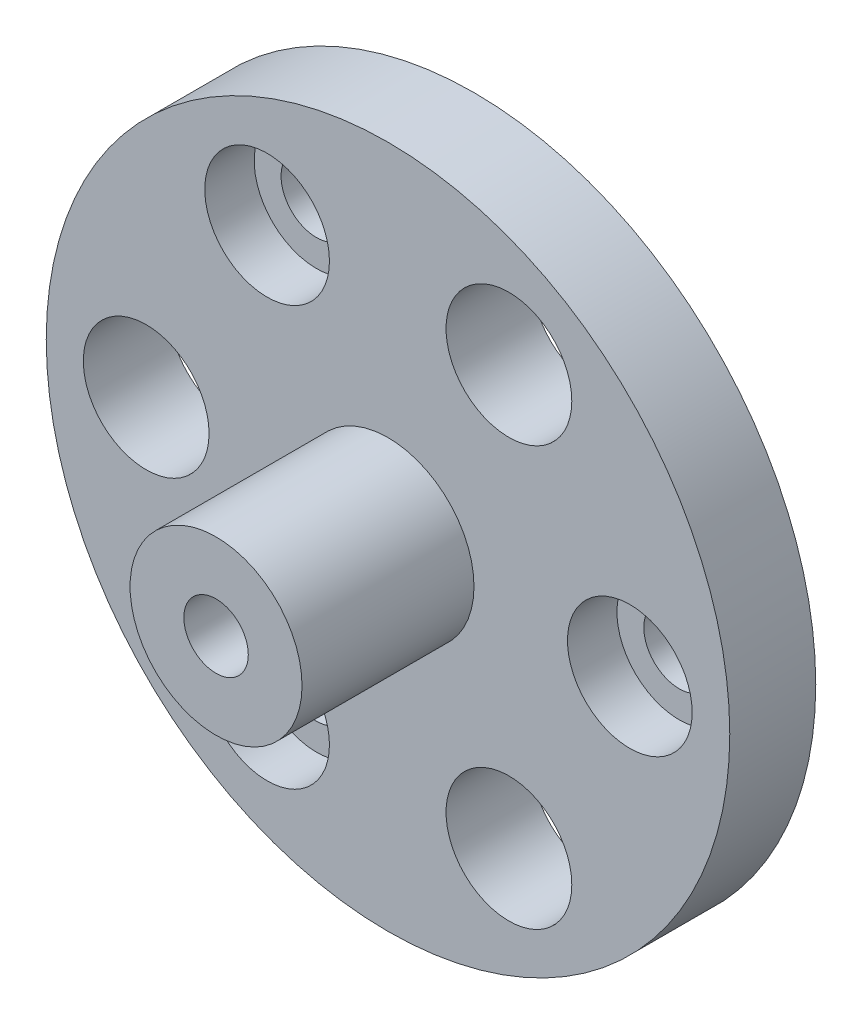
ISO-10303-21;
HEADER;
FILE_DESCRIPTION(('STEP AP214'),'2;1');
FILE_NAME('part.step','',(''),(''),'','','');
FILE_SCHEMA(('AUTOMOTIVE_DESIGN { 1 0 10303 214 1 1 1 1 }'));
ENDSEC;
DATA;
#1=APPLICATION_CONTEXT('core data for automotive mechanical design processes');
#2=APPLICATION_PROTOCOL_DEFINITION('international standard','automotive_design',2000,#1);
#3=PRODUCT_CONTEXT('',#1,'mechanical');
#4=PRODUCT('Part','Part','',(#3));
#5=PRODUCT_RELATED_PRODUCT_CATEGORY('part','',(#4));
#6=PRODUCT_DEFINITION_FORMATION('','',#4);
#7=PRODUCT_DEFINITION_CONTEXT('part definition',#1,'design');
#8=PRODUCT_DEFINITION('design','',#6,#7);
#9=PRODUCT_DEFINITION_SHAPE('','',#8);
#10=(LENGTH_UNIT() NAMED_UNIT(*) SI_UNIT(.MILLI.,.METRE.));
#11=(NAMED_UNIT(*) PLANE_ANGLE_UNIT() SI_UNIT($,.RADIAN.));
#12=(NAMED_UNIT(*) SI_UNIT($,.STERADIAN.) SOLID_ANGLE_UNIT());
#13=UNCERTAINTY_MEASURE_WITH_UNIT(LENGTH_MEASURE(1.E-05),#10,'distance_accuracy_value','');
#14=(GEOMETRIC_REPRESENTATION_CONTEXT(3) GLOBAL_UNCERTAINTY_ASSIGNED_CONTEXT((#13)) GLOBAL_UNIT_ASSIGNED_CONTEXT((#10,
#11,#12)) REPRESENTATION_CONTEXT('',''));
#15=CARTESIAN_POINT('',(0.,0.,0.));
#16=DIRECTION('',(0.,0.,1.));
#17=DIRECTION('',(1.,0.,0.));
#18=AXIS2_PLACEMENT_3D('',#15,#16,#17);
#19=CARTESIAN_POINT('',(14.2060725138052,15.206748874826,1002.15499802001));
#20=DIRECTION('',(0.,0.,-1.));
#21=DIRECTION('',(-1.,0.,0.));
#22=AXIS2_PLACEMENT_3D('',#19,#20,#21);
#23=CYLINDRICAL_SURFACE('',#22,1.65000000000001);
#24=CARTESIAN_POINT('',(14.2060725138052,15.206748874826,998.154998020007));
#25=DIRECTION('',(0.,0.,1.));
#26=DIRECTION('',(1.,0.,0.));
#27=AXIS2_PLACEMENT_3D('',#24,#25,#26);
#28=CIRCLE('',#27,1.65000000000001);
#29=CARTESIAN_POINT('',(15.8560725138052,15.206748874826,998.154998020007));
#30=VERTEX_POINT('',#29);
#31=EDGE_CURVE('E105',#30,#30,#28,.T.);
#32=ORIENTED_EDGE('',*,*,#31,.F.);
#33=EDGE_LOOP('',(#32));
#34=FACE_BOUND('',#33,.T.);
#35=CARTESIAN_POINT('',(14.2060725138052,15.206748874826,999.854998020007));
#36=DIRECTION('',(0.,0.,1.));
#37=DIRECTION('',(1.,0.,0.));
#38=AXIS2_PLACEMENT_3D('',#35,#36,#37);
#39=CIRCLE('',#38,1.65000000000001);
#40=CARTESIAN_POINT('',(15.8560725138052,15.206748874826,999.854998020007));
#41=VERTEX_POINT('',#40);
#42=EDGE_CURVE('E43',#41,#41,#39,.T.);
#43=ORIENTED_EDGE('',*,*,#42,.T.);
#44=EDGE_LOOP('',(#43));
#45=FACE_BOUND('',#44,.T.);
#46=ADVANCED_FACE('F39',(#34,#45),#23,.F.);
#47=CARTESIAN_POINT('',(-2.66892748619479,5.46396308225111,1002.15499802001));
#48=DIRECTION('',(0.,0.,-1.));
#49=DIRECTION('',(-1.,0.,0.));
#50=AXIS2_PLACEMENT_3D('',#47,#48,#49);
#51=CYLINDRICAL_SURFACE('',#50,1.65000000000001);
#52=CARTESIAN_POINT('',(-2.66892748619479,5.46396308225111,998.154998020007));
#53=DIRECTION('',(0.,0.,1.));
#54=DIRECTION('',(1.,0.,0.));
#55=AXIS2_PLACEMENT_3D('',#52,#53,#54);
#56=CIRCLE('',#55,1.65000000000001);
#57=CARTESIAN_POINT('',(-1.01892748619478,5.46396308225111,998.154998020007));
#58=VERTEX_POINT('',#57);
#59=EDGE_CURVE('E103',#58,#58,#56,.T.);
#60=ORIENTED_EDGE('',*,*,#59,.F.);
#61=EDGE_LOOP('',(#60));
#62=FACE_BOUND('',#61,.T.);
#63=CARTESIAN_POINT('',(-2.66892748619479,5.46396308225111,999.854998020007));
#64=DIRECTION('',(0.,0.,1.));
#65=DIRECTION('',(1.,0.,0.));
#66=AXIS2_PLACEMENT_3D('',#63,#64,#65);
#67=CIRCLE('',#66,1.65000000000001);
#68=CARTESIAN_POINT('',(-1.01892748619478,5.46396308225111,999.854998020007));
#69=VERTEX_POINT('',#68);
#70=EDGE_CURVE('E59',#69,#69,#67,.T.);
#71=ORIENTED_EDGE('',*,*,#70,.T.);
#72=EDGE_LOOP('',(#71));
#73=FACE_BOUND('',#72,.T.);
#74=ADVANCED_FACE('F131',(#62,#73),#51,.F.);
#75=CARTESIAN_POINT('',(-2.66892748619463,24.949534667401,1002.15499802001));
#76=DIRECTION('',(0.,0.,-1.));
#77=DIRECTION('',(-1.,0.,0.));
#78=AXIS2_PLACEMENT_3D('',#75,#76,#77);
#79=CYLINDRICAL_SURFACE('',#78,1.64999999999998);
#80=CARTESIAN_POINT('',(-2.66892748619463,24.949534667401,998.154998020007));
#81=DIRECTION('',(0.,0.,1.));
#82=DIRECTION('',(1.,0.,0.));
#83=AXIS2_PLACEMENT_3D('',#80,#81,#82);
#84=CIRCLE('',#83,1.64999999999998);
#85=CARTESIAN_POINT('',(-1.01892748619464,24.949534667401,998.154998020007));
#86=VERTEX_POINT('',#85);
#87=EDGE_CURVE('E98',#86,#86,#84,.T.);
#88=ORIENTED_EDGE('',*,*,#87,.F.);
#89=EDGE_LOOP('',(#88));
#90=FACE_BOUND('',#89,.T.);
#91=CARTESIAN_POINT('',(-2.66892748619463,24.949534667401,999.854998020007));
#92=DIRECTION('',(0.,0.,1.));
#93=DIRECTION('',(1.,0.,0.));
#94=AXIS2_PLACEMENT_3D('',#91,#92,#93);
#95=CIRCLE('',#94,1.64999999999998);
#96=CARTESIAN_POINT('',(-1.01892748619464,24.949534667401,999.854998020007));
#97=VERTEX_POINT('',#96);
#98=EDGE_CURVE('E57',#97,#97,#95,.T.);
#99=ORIENTED_EDGE('',*,*,#98,.T.);
#100=EDGE_LOOP('',(#99));
#101=FACE_BOUND('',#100,.T.);
#102=ADVANCED_FACE('F137',(#90,#101),#79,.F.);
#103=CARTESIAN_POINT('',(2.95607251380525,15.206748874826,1002.15499802001));
#104=DIRECTION('',(0.,0.,1.));
#105=DIRECTION('',(1.,0.,0.));
#106=AXIS2_PLACEMENT_3D('',#103,#104,#105);
#107=PLANE('',#106);
#108=CARTESIAN_POINT('',(-2.66892748619463,24.949534667401,1002.15499802001));
#109=DIRECTION('',(0.,0.,1.));
#110=DIRECTION('',(1.,0.,0.));
#111=AXIS2_PLACEMENT_3D('',#108,#109,#110);
#112=CIRCLE('',#111,2.9);
#113=CARTESIAN_POINT('',(0.231072513805372,24.949534667401,1002.15499802001));
#114=VERTEX_POINT('',#113);
#115=EDGE_CURVE('E186',#114,#114,#112,.T.);
#116=ORIENTED_EDGE('',*,*,#115,.F.);
#117=EDGE_LOOP('',(#116));
#118=FACE_BOUND('',#117,.T.);
#119=CARTESIAN_POINT('',(14.2060725138052,15.206748874826,1002.15499802001));
#120=DIRECTION('',(0.,0.,1.));
#121=DIRECTION('',(1.,0.,0.));
#122=AXIS2_PLACEMENT_3D('',#119,#120,#121);
#123=CIRCLE('',#122,2.9);
#124=CARTESIAN_POINT('',(17.1060725138052,15.206748874826,1002.15499802001));
#125=VERTEX_POINT('',#124);
#126=EDGE_CURVE('E189',#125,#125,#123,.T.);
#127=ORIENTED_EDGE('',*,*,#126,.F.);
#128=EDGE_LOOP('',(#127));
#129=FACE_BOUND('',#128,.T.);
#130=CARTESIAN_POINT('',(-2.66892748619479,5.46396308225111,1002.15499802001));
#131=DIRECTION('',(0.,0.,1.));
#132=DIRECTION('',(1.,0.,0.));
#133=AXIS2_PLACEMENT_3D('',#130,#131,#132);
#134=CIRCLE('',#133,2.9);
#135=CARTESIAN_POINT('',(0.231072513805206,5.46396308225111,1002.15499802001));
#136=VERTEX_POINT('',#135);
#137=EDGE_CURVE('E196',#136,#136,#134,.T.);
#138=ORIENTED_EDGE('',*,*,#137,.F.);
#139=EDGE_LOOP('',(#138));
#140=FACE_BOUND('',#139,.T.);
#141=CARTESIAN_POINT('',(8.58107251380516,5.46396308225099,1002.15499802001));
#142=DIRECTION('',(0.,0.,1.));
#143=DIRECTION('',(1.,0.,0.));
#144=AXIS2_PLACEMENT_3D('',#141,#142,#143);
#145=CIRCLE('',#144,2.92500000000001);
#146=CARTESIAN_POINT('',(11.5060725138052,5.46396308225099,1002.15499802001));
#147=VERTEX_POINT('',#146);
#148=EDGE_CURVE('E83',#147,#147,#145,.T.);
#149=ORIENTED_EDGE('',*,*,#148,.F.);
#150=EDGE_LOOP('',(#149));
#151=FACE_BOUND('',#150,.T.);
#152=CARTESIAN_POINT('',(-8.29392748619476,15.206748874826,1002.15499802001));
#153=DIRECTION('',(0.,0.,1.));
#154=DIRECTION('',(1.,0.,0.));
#155=AXIS2_PLACEMENT_3D('',#152,#153,#154);
#156=CIRCLE('',#155,2.92500000000001);
#157=CARTESIAN_POINT('',(-5.36892748619475,15.206748874826,1002.15499802001));
#158=VERTEX_POINT('',#157);
#159=EDGE_CURVE('E95',#158,#158,#156,.T.);
#160=ORIENTED_EDGE('',*,*,#159,.F.);
#161=EDGE_LOOP('',(#160));
#162=FACE_BOUND('',#161,.T.);
#163=CARTESIAN_POINT('',(2.95607251380525,15.206748874826,1002.15499802001));
#164=DIRECTION('',(0.,0.,1.));
#165=DIRECTION('',(1.,0.,0.));
#166=AXIS2_PLACEMENT_3D('',#163,#164,#165);
#167=CIRCLE('',#166,15.9);
#168=CARTESIAN_POINT('',(18.8560725138052,15.206748874826,1002.15499802001));
#169=VERTEX_POINT('',#168);
#170=EDGE_CURVE('E10',#169,#169,#167,.T.);
#171=ORIENTED_EDGE('',*,*,#170,.T.);
#172=EDGE_LOOP('',(#171));
#173=FACE_BOUND('',#172,.T.);
#174=CARTESIAN_POINT('',(8.5810725138053,24.9495346674009,1002.15499802001));
#175=DIRECTION('',(0.,0.,1.));
#176=DIRECTION('',(1.,0.,0.));
#177=AXIS2_PLACEMENT_3D('',#174,#175,#176);
#178=CIRCLE('',#177,2.92500000000001);
#179=CARTESIAN_POINT('',(11.5060725138053,24.9495346674009,1002.15499802001));
#180=VERTEX_POINT('',#179);
#181=EDGE_CURVE('E89',#180,#180,#178,.T.);
#182=ORIENTED_EDGE('',*,*,#181,.F.);
#183=EDGE_LOOP('',(#182));
#184=FACE_BOUND('',#183,.T.);
#185=CARTESIAN_POINT('',(2.95607251380525,15.206748874826,1002.15499802001));
#186=DIRECTION('',(0.,0.,1.));
#187=DIRECTION('',(1.,0.,0.));
#188=AXIS2_PLACEMENT_3D('',#185,#186,#187);
#189=CIRCLE('',#188,4.);
#190=CARTESIAN_POINT('',(6.95607251380525,15.206748874826,1002.15499802001));
#191=VERTEX_POINT('',#190);
#192=EDGE_CURVE('E69',#191,#191,#189,.T.);
#193=ORIENTED_EDGE('',*,*,#192,.F.);
#194=EDGE_LOOP('',(#193));
#195=FACE_BOUND('',#194,.T.);
#196=ADVANCED_FACE('F142',(#118,#129,#140,#151,#162,#173,#184,#195),#107,.T.);
#197=CARTESIAN_POINT('',(2.95607251380525,15.206748874826,998.154998020007));
#198=DIRECTION('',(0.,0.,1.));
#199=DIRECTION('',(1.,0.,0.));
#200=AXIS2_PLACEMENT_3D('',#197,#198,#199);
#201=PLANE('',#200);
#202=CARTESIAN_POINT('',(2.95607251380525,15.206748874826,998.154998020007));
#203=DIRECTION('',(0.,0.,1.));
#204=DIRECTION('',(1.,0.,0.));
#205=AXIS2_PLACEMENT_3D('',#202,#203,#204);
#206=CIRCLE('',#205,15.9);
#207=CARTESIAN_POINT('',(18.8560725138052,15.206748874826,998.154998020007));
#208=VERTEX_POINT('',#207);
#209=EDGE_CURVE('E47',#208,#208,#206,.T.);
#210=ORIENTED_EDGE('',*,*,#209,.F.);
#211=EDGE_LOOP('',(#210));
#212=FACE_BOUND('',#211,.T.);
#213=CARTESIAN_POINT('',(2.95607251380525,15.206748874826,998.154998020007));
#214=DIRECTION('',(0.,0.,1.));
#215=DIRECTION('',(1.,0.,0.));
#216=AXIS2_PLACEMENT_3D('',#213,#214,#215);
#217=CIRCLE('',#216,1.5);
#218=CARTESIAN_POINT('',(4.45607251380525,15.206748874826,998.154998020007));
#219=VERTEX_POINT('',#218);
#220=EDGE_CURVE('E52',#219,#219,#217,.T.);
#221=ORIENTED_EDGE('',*,*,#220,.T.);
#222=EDGE_LOOP('',(#221));
#223=FACE_BOUND('',#222,.T.);
#224=ORIENTED_EDGE('',*,*,#31,.T.);
#225=EDGE_LOOP('',(#224));
#226=FACE_BOUND('',#225,.T.);
#227=ORIENTED_EDGE('',*,*,#59,.T.);
#228=EDGE_LOOP('',(#227));
#229=FACE_BOUND('',#228,.T.);
#230=ORIENTED_EDGE('',*,*,#87,.T.);
#231=EDGE_LOOP('',(#230));
#232=FACE_BOUND('',#231,.T.);
#233=CARTESIAN_POINT('',(-8.29392748619476,15.206748874826,998.154998020007));
#234=DIRECTION('',(0.,0.,1.));
#235=DIRECTION('',(1.,0.,0.));
#236=AXIS2_PLACEMENT_3D('',#233,#234,#235);
#237=CIRCLE('',#236,2.92500000000001);
#238=CARTESIAN_POINT('',(-5.36892748619475,15.206748874826,998.154998020007));
#239=VERTEX_POINT('',#238);
#240=EDGE_CURVE('E92',#239,#239,#237,.T.);
#241=ORIENTED_EDGE('',*,*,#240,.T.);
#242=EDGE_LOOP('',(#241));
#243=FACE_BOUND('',#242,.T.);
#244=CARTESIAN_POINT('',(8.5810725138053,24.9495346674009,998.154998020007));
#245=DIRECTION('',(0.,0.,1.));
#246=DIRECTION('',(1.,0.,0.));
#247=AXIS2_PLACEMENT_3D('',#244,#245,#246);
#248=CIRCLE('',#247,2.92500000000001);
#249=CARTESIAN_POINT('',(11.5060725138053,24.9495346674009,998.154998020007));
#250=VERTEX_POINT('',#249);
#251=EDGE_CURVE('E86',#250,#250,#248,.T.);
#252=ORIENTED_EDGE('',*,*,#251,.T.);
#253=EDGE_LOOP('',(#252));
#254=FACE_BOUND('',#253,.T.);
#255=CARTESIAN_POINT('',(8.58107251380516,5.46396308225099,998.154998020007));
#256=DIRECTION('',(0.,0.,1.));
#257=DIRECTION('',(1.,0.,0.));
#258=AXIS2_PLACEMENT_3D('',#255,#256,#257);
#259=CIRCLE('',#258,2.92500000000001);
#260=CARTESIAN_POINT('',(11.5060725138052,5.46396308225099,998.154998020007));
#261=VERTEX_POINT('',#260);
#262=EDGE_CURVE('E81',#261,#261,#259,.T.);
#263=ORIENTED_EDGE('',*,*,#262,.T.);
#264=EDGE_LOOP('',(#263));
#265=FACE_BOUND('',#264,.T.);
#266=ADVANCED_FACE('F112',(#212,#223,#226,#229,#232,#243,#254,#265),#201,.F.);
#267=CARTESIAN_POINT('',(2.95607251380525,15.206748874826,1002.15499802001));
#268=DIRECTION('',(0.,0.,-1.));
#269=DIRECTION('',(-1.,0.,0.));
#270=AXIS2_PLACEMENT_3D('',#267,#268,#269);
#271=CYLINDRICAL_SURFACE('',#270,15.9);
#272=ORIENTED_EDGE('',*,*,#170,.F.);
#273=EDGE_LOOP('',(#272));
#274=FACE_BOUND('',#273,.T.);
#275=ORIENTED_EDGE('',*,*,#209,.T.);
#276=EDGE_LOOP('',(#275));
#277=FACE_BOUND('',#276,.T.);
#278=ADVANCED_FACE('F41',(#274,#277),#271,.T.);
#279=CARTESIAN_POINT('',(2.95607251380525,15.206748874826,1002.15499802001));
#280=DIRECTION('',(0.,0.,-1.));
#281=DIRECTION('',(-1.,0.,0.));
#282=AXIS2_PLACEMENT_3D('',#279,#280,#281);
#283=CYLINDRICAL_SURFACE('',#282,1.5);
#284=ORIENTED_EDGE('',*,*,#220,.F.);
#285=EDGE_LOOP('',(#284));
#286=FACE_BOUND('',#285,.T.);
#287=CARTESIAN_POINT('',(2.95607251380525,15.206748874826,1010.15499802001));
#288=DIRECTION('',(0.,0.,1.));
#289=DIRECTION('',(1.,0.,0.));
#290=AXIS2_PLACEMENT_3D('',#287,#288,#289);
#291=CIRCLE('',#290,1.5);
#292=CARTESIAN_POINT('',(4.45607251380525,15.206748874826,1010.15499802001));
#293=VERTEX_POINT('',#292);
#294=EDGE_CURVE('E65',#293,#293,#291,.T.);
#295=ORIENTED_EDGE('',*,*,#294,.T.);
#296=EDGE_LOOP('',(#295));
#297=FACE_BOUND('',#296,.T.);
#298=ADVANCED_FACE('F114',(#286,#297),#283,.F.);
#299=CARTESIAN_POINT('',(-8.29392748619476,15.206748874826,1002.15499802001));
#300=DIRECTION('',(0.,0.,-1.));
#301=DIRECTION('',(-1.,0.,0.));
#302=AXIS2_PLACEMENT_3D('',#299,#300,#301);
#303=CYLINDRICAL_SURFACE('',#302,2.92500000000001);
#304=ORIENTED_EDGE('',*,*,#159,.T.);
#305=EDGE_LOOP('',(#304));
#306=FACE_BOUND('',#305,.T.);
#307=ORIENTED_EDGE('',*,*,#240,.F.);
#308=EDGE_LOOP('',(#307));
#309=FACE_BOUND('',#308,.T.);
#310=ADVANCED_FACE('F116',(#306,#309),#303,.F.);
#311=CARTESIAN_POINT('',(8.5810725138053,24.9495346674009,1002.15499802001));
#312=DIRECTION('',(0.,0.,-1.));
#313=DIRECTION('',(-1.,0.,0.));
#314=AXIS2_PLACEMENT_3D('',#311,#312,#313);
#315=CYLINDRICAL_SURFACE('',#314,2.92500000000001);
#316=ORIENTED_EDGE('',*,*,#181,.T.);
#317=EDGE_LOOP('',(#316));
#318=FACE_BOUND('',#317,.T.);
#319=ORIENTED_EDGE('',*,*,#251,.F.);
#320=EDGE_LOOP('',(#319));
#321=FACE_BOUND('',#320,.T.);
#322=ADVANCED_FACE('F123',(#318,#321),#315,.F.);
#323=CARTESIAN_POINT('',(8.58107251380516,5.46396308225099,1002.15499802001));
#324=DIRECTION('',(0.,0.,-1.));
#325=DIRECTION('',(-1.,0.,0.));
#326=AXIS2_PLACEMENT_3D('',#323,#324,#325);
#327=CYLINDRICAL_SURFACE('',#326,2.92500000000001);
#328=ORIENTED_EDGE('',*,*,#148,.T.);
#329=EDGE_LOOP('',(#328));
#330=FACE_BOUND('',#329,.T.);
#331=ORIENTED_EDGE('',*,*,#262,.F.);
#332=EDGE_LOOP('',(#331));
#333=FACE_BOUND('',#332,.T.);
#334=ADVANCED_FACE('F147',(#330,#333),#327,.F.);
#335=CARTESIAN_POINT('',(2.95607251380525,15.206748874826,1010.15499802001));
#336=DIRECTION('',(0.,0.,1.));
#337=DIRECTION('',(1.,0.,0.));
#338=AXIS2_PLACEMENT_3D('',#335,#336,#337);
#339=PLANE('',#338);
#340=CARTESIAN_POINT('',(2.95607251380525,15.206748874826,1010.15499802001));
#341=DIRECTION('',(0.,0.,1.));
#342=DIRECTION('',(1.,0.,0.));
#343=AXIS2_PLACEMENT_3D('',#340,#341,#342);
#344=CIRCLE('',#343,4.);
#345=CARTESIAN_POINT('',(6.95607251380525,15.206748874826,1010.15499802001));
#346=VERTEX_POINT('',#345);
#347=EDGE_CURVE('E74',#346,#346,#344,.T.);
#348=ORIENTED_EDGE('',*,*,#347,.T.);
#349=EDGE_LOOP('',(#348));
#350=FACE_BOUND('',#349,.T.);
#351=ORIENTED_EDGE('',*,*,#294,.F.);
#352=EDGE_LOOP('',(#351));
#353=FACE_BOUND('',#352,.T.);
#354=ADVANCED_FACE('F150',(#350,#353),#339,.T.);
#355=CARTESIAN_POINT('',(2.95607251380525,15.206748874826,1010.15499802001));
#356=DIRECTION('',(0.,0.,-1.));
#357=DIRECTION('',(-1.,0.,0.));
#358=AXIS2_PLACEMENT_3D('',#355,#356,#357);
#359=CYLINDRICAL_SURFACE('',#358,4.);
#360=ORIENTED_EDGE('',*,*,#347,.F.);
#361=EDGE_LOOP('',(#360));
#362=FACE_BOUND('',#361,.T.);
#363=ORIENTED_EDGE('',*,*,#192,.T.);
#364=EDGE_LOOP('',(#363));
#365=FACE_BOUND('',#364,.T.);
#366=ADVANCED_FACE('F152',(#362,#365),#359,.T.);
#367=CARTESIAN_POINT('',(-2.66892748619463,24.949534667401,999.854998020007));
#368=DIRECTION('',(0.,0.,1.));
#369=DIRECTION('',(1.,0.,0.));
#370=AXIS2_PLACEMENT_3D('',#367,#368,#369);
#371=CYLINDRICAL_SURFACE('',#370,2.9);
#372=CARTESIAN_POINT('',(-2.66892748619463,24.949534667401,999.854998020007));
#373=DIRECTION('',(0.,0.,1.));
#374=DIRECTION('',(1.,0.,0.));
#375=AXIS2_PLACEMENT_3D('',#372,#373,#374);
#376=CIRCLE('',#375,2.9);
#377=CARTESIAN_POINT('',(0.231072513805372,24.949534667401,999.854998020007));
#378=VERTEX_POINT('',#377);
#379=EDGE_CURVE('E60',#378,#378,#376,.T.);
#380=ORIENTED_EDGE('',*,*,#379,.F.);
#381=EDGE_LOOP('',(#380));
#382=FACE_BOUND('',#381,.T.);
#383=ORIENTED_EDGE('',*,*,#115,.T.);
#384=EDGE_LOOP('',(#383));
#385=FACE_BOUND('',#384,.T.);
#386=ADVANCED_FACE('F154',(#382,#385),#371,.F.);
#387=CARTESIAN_POINT('',(-2.66892748619463,24.949534667401,999.854998020007));
#388=DIRECTION('',(0.,0.,1.));
#389=DIRECTION('',(1.,0.,0.));
#390=AXIS2_PLACEMENT_3D('',#387,#388,#389);
#391=PLANE('',#390);
#392=ORIENTED_EDGE('',*,*,#98,.F.);
#393=EDGE_LOOP('',(#392));
#394=FACE_BOUND('',#393,.T.);
#395=ORIENTED_EDGE('',*,*,#379,.T.);
#396=EDGE_LOOP('',(#395));
#397=FACE_BOUND('',#396,.T.);
#398=ADVANCED_FACE('F166',(#394,#397),#391,.T.);
#399=CARTESIAN_POINT('',(-2.66892748619479,5.46396308225111,999.854998020007));
#400=DIRECTION('',(0.,0.,1.));
#401=DIRECTION('',(1.,0.,0.));
#402=AXIS2_PLACEMENT_3D('',#399,#400,#401);
#403=CYLINDRICAL_SURFACE('',#402,2.9);
#404=CARTESIAN_POINT('',(-2.66892748619479,5.46396308225111,999.854998020007));
#405=DIRECTION('',(0.,0.,1.));
#406=DIRECTION('',(1.,0.,0.));
#407=AXIS2_PLACEMENT_3D('',#404,#405,#406);
#408=CIRCLE('',#407,2.9);
#409=CARTESIAN_POINT('',(0.231072513805206,5.46396308225111,999.854998020007));
#410=VERTEX_POINT('',#409);
#411=EDGE_CURVE('E78',#410,#410,#408,.T.);
#412=ORIENTED_EDGE('',*,*,#411,.F.);
#413=EDGE_LOOP('',(#412));
#414=FACE_BOUND('',#413,.T.);
#415=ORIENTED_EDGE('',*,*,#137,.T.);
#416=EDGE_LOOP('',(#415));
#417=FACE_BOUND('',#416,.T.);
#418=ADVANCED_FACE('F162',(#414,#417),#403,.F.);
#419=CARTESIAN_POINT('',(-2.66892748619479,5.46396308225111,999.854998020007));
#420=DIRECTION('',(0.,0.,1.));
#421=DIRECTION('',(1.,0.,0.));
#422=AXIS2_PLACEMENT_3D('',#419,#420,#421);
#423=PLANE('',#422);
#424=ORIENTED_EDGE('',*,*,#70,.F.);
#425=EDGE_LOOP('',(#424));
#426=FACE_BOUND('',#425,.T.);
#427=ORIENTED_EDGE('',*,*,#411,.T.);
#428=EDGE_LOOP('',(#427));
#429=FACE_BOUND('',#428,.T.);
#430=ADVANCED_FACE('F158',(#426,#429),#423,.T.);
#431=CARTESIAN_POINT('',(14.2060725138052,15.206748874826,999.854998020007));
#432=DIRECTION('',(0.,0.,1.));
#433=DIRECTION('',(1.,0.,0.));
#434=AXIS2_PLACEMENT_3D('',#431,#432,#433);
#435=CYLINDRICAL_SURFACE('',#434,2.9);
#436=CARTESIAN_POINT('',(14.2060725138052,15.206748874826,999.854998020007));
#437=DIRECTION('',(0.,0.,1.));
#438=DIRECTION('',(1.,0.,0.));
#439=AXIS2_PLACEMENT_3D('',#436,#437,#438);
#440=CIRCLE('',#439,2.9);
#441=CARTESIAN_POINT('',(17.1060725138052,15.206748874826,999.854998020007));
#442=VERTEX_POINT('',#441);
#443=EDGE_CURVE('E194',#442,#442,#440,.T.);
#444=ORIENTED_EDGE('',*,*,#443,.F.);
#445=EDGE_LOOP('',(#444));
#446=FACE_BOUND('',#445,.T.);
#447=ORIENTED_EDGE('',*,*,#126,.T.);
#448=EDGE_LOOP('',(#447));
#449=FACE_BOUND('',#448,.T.);
#450=ADVANCED_FACE('F161',(#446,#449),#435,.F.);
#451=CARTESIAN_POINT('',(14.2060725138052,15.206748874826,999.854998020007));
#452=DIRECTION('',(0.,0.,1.));
#453=DIRECTION('',(1.,0.,0.));
#454=AXIS2_PLACEMENT_3D('',#451,#452,#453);
#455=PLANE('',#454);
#456=ORIENTED_EDGE('',*,*,#42,.F.);
#457=EDGE_LOOP('',(#456));
#458=FACE_BOUND('',#457,.T.);
#459=ORIENTED_EDGE('',*,*,#443,.T.);
#460=EDGE_LOOP('',(#459));
#461=FACE_BOUND('',#460,.T.);
#462=ADVANCED_FACE('F168',(#458,#461),#455,.T.);
#463=CLOSED_SHELL('',(#46,#74,#102,#196,#266,#278,#298,#310,#322,#334,#354,#366,#386,#398,#418,
#430,#450,#462));
#464=MANIFOLD_SOLID_BREP('B2',#463);
#465=ADVANCED_BREP_SHAPE_REPRESENTATION('',(#18,#464),#14);
#466=SHAPE_DEFINITION_REPRESENTATION(#9,#465);
ENDSEC;
END-ISO-10303-21;
